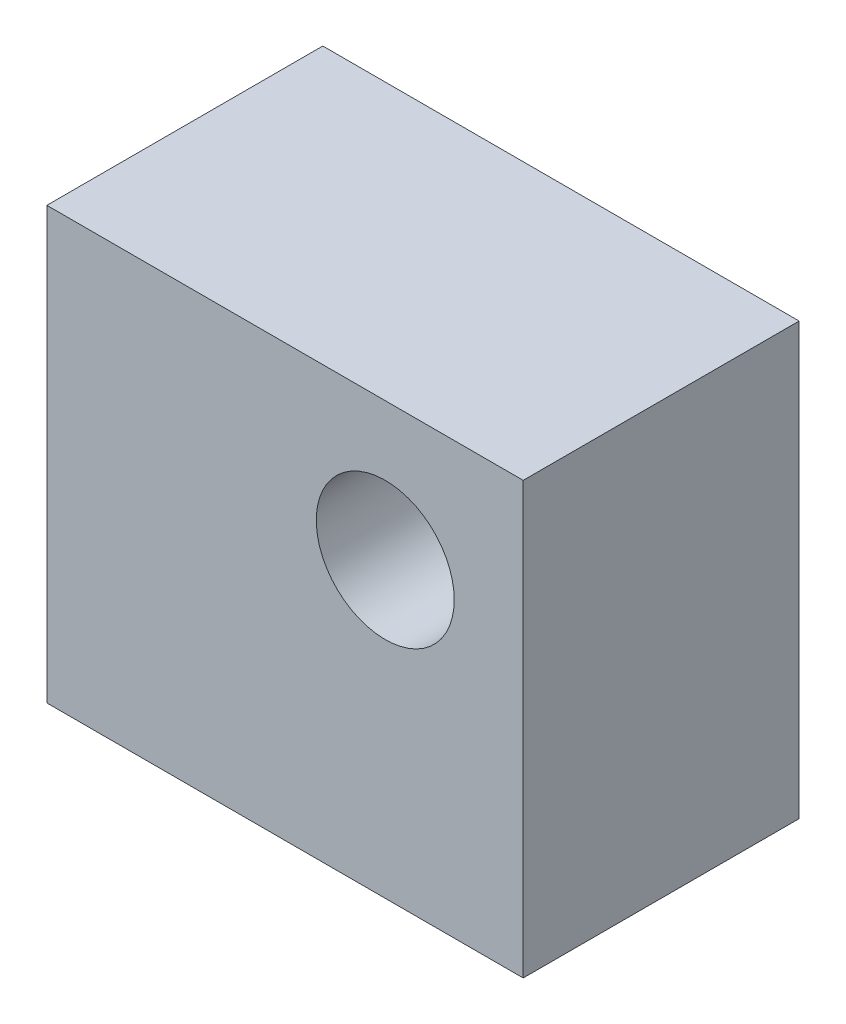
ISO-10303-21;
HEADER;
FILE_DESCRIPTION(('STEP AP214'),'2;1');
FILE_NAME('part.step','',(''),(''),'','','');
FILE_SCHEMA(('AUTOMOTIVE_DESIGN { 1 0 10303 214 1 1 1 1 }'));
ENDSEC;
DATA;
#1=APPLICATION_CONTEXT('core data for automotive mechanical design processes');
#2=APPLICATION_PROTOCOL_DEFINITION('international standard','automotive_design',2000,#1);
#3=PRODUCT_CONTEXT('',#1,'mechanical');
#4=PRODUCT('Part','Part','',(#3));
#5=PRODUCT_RELATED_PRODUCT_CATEGORY('part','',(#4));
#6=PRODUCT_DEFINITION_FORMATION('','',#4);
#7=PRODUCT_DEFINITION_CONTEXT('part definition',#1,'design');
#8=PRODUCT_DEFINITION('design','',#6,#7);
#9=PRODUCT_DEFINITION_SHAPE('','',#8);
#10=(LENGTH_UNIT() NAMED_UNIT(*) SI_UNIT(.MILLI.,.METRE.));
#11=(NAMED_UNIT(*) PLANE_ANGLE_UNIT() SI_UNIT($,.RADIAN.));
#12=(NAMED_UNIT(*) SI_UNIT($,.STERADIAN.) SOLID_ANGLE_UNIT());
#13=UNCERTAINTY_MEASURE_WITH_UNIT(LENGTH_MEASURE(1.E-05),#10,'distance_accuracy_value','');
#14=(GEOMETRIC_REPRESENTATION_CONTEXT(3) GLOBAL_UNCERTAINTY_ASSIGNED_CONTEXT((#13)) GLOBAL_UNIT_ASSIGNED_CONTEXT((#10,
#11,#12)) REPRESENTATION_CONTEXT('',''));
#15=CARTESIAN_POINT('',(0.,0.,0.));
#16=DIRECTION('',(0.,0.,1.));
#17=DIRECTION('',(1.,0.,0.));
#18=AXIS2_PLACEMENT_3D('',#15,#16,#17);
#19=CARTESIAN_POINT('',(0.,-19.8376419710467,6.35));
#20=DIRECTION('',(0.,1.,0.));
#21=DIRECTION('',(-1.,0.,0.));
#22=AXIS2_PLACEMENT_3D('',#19,#20,#21);
#23=PLANE('',#22);
#24=DIRECTION('',(1.,0.,0.));
#25=VECTOR('',#24,1.);
#26=CARTESIAN_POINT('',(0.,-19.8376419710467,-6.35));
#27=LINE('',#26,#25);
#28=CARTESIAN_POINT('',(0.,-19.8376419710467,-6.35));
#29=VERTEX_POINT('',#28);
#30=CARTESIAN_POINT('',(21.9241874454343,-19.8376419710468,-6.35));
#31=VERTEX_POINT('',#30);
#32=EDGE_CURVE('E95',#29,#31,#27,.T.);
#33=ORIENTED_EDGE('',*,*,#32,.T.);
#34=DIRECTION('',(0.,0.,-1.));
#35=VECTOR('',#34,1.);
#36=CARTESIAN_POINT('',(21.9241874454343,-19.8376419710468,6.35));
#37=LINE('',#36,#35);
#38=CARTESIAN_POINT('',(21.9241874454343,-19.8376419710468,6.35));
#39=VERTEX_POINT('',#38);
#40=EDGE_CURVE('E93',#39,#31,#37,.T.);
#41=ORIENTED_EDGE('',*,*,#40,.F.);
#42=DIRECTION('',(1.,0.,0.));
#43=VECTOR('',#42,1.);
#44=CARTESIAN_POINT('',(0.,-19.8376419710467,6.35));
#45=LINE('',#44,#43);
#46=CARTESIAN_POINT('',(0.,-19.8376419710467,6.35));
#47=VERTEX_POINT('',#46);
#48=EDGE_CURVE('E85',#47,#39,#45,.T.);
#49=ORIENTED_EDGE('',*,*,#48,.F.);
#50=DIRECTION('',(0.,0.,-1.));
#51=VECTOR('',#50,1.);
#52=CARTESIAN_POINT('',(0.,-19.8376419710467,6.35));
#53=LINE('',#52,#51);
#54=EDGE_CURVE('E46',#47,#29,#53,.T.);
#55=ORIENTED_EDGE('',*,*,#54,.T.);
#56=EDGE_LOOP('',(#33,#41,#49,#55));
#57=FACE_BOUND('',#56,.T.);
#58=CARTESIAN_POINT('',(7.78709372271712,-19.8376419710468,0.));
#59=DIRECTION('',(0.,1.,0.));
#60=DIRECTION('',(1.,0.,0.));
#61=AXIS2_PLACEMENT_3D('',#58,#59,#60);
#62=ELLIPSE('',#61,3.66617420935412,3.175);
#63=CARTESIAN_POINT('',(11.4532679320712,-19.8376419710468,0.));
#64=VERTEX_POINT('',#63);
#65=EDGE_CURVE('E11',#64,#64,#62,.F.);
#66=ORIENTED_EDGE('',*,*,#65,.F.);
#67=EDGE_LOOP('',(#66));
#68=FACE_BOUND('',#67,.T.);
#69=ADVANCED_FACE('F37',(#57,#68),#23,.F.);
#70=CARTESIAN_POINT('',(0.,0.,6.35));
#71=DIRECTION('',(1.,0.,0.));
#72=DIRECTION('',(0.,1.,0.));
#73=AXIS2_PLACEMENT_3D('',#70,#71,#72);
#74=PLANE('',#73);
#75=CARTESIAN_POINT('',(0.,-6.35,0.));
#76=DIRECTION('',(-1.,0.,0.));
#77=DIRECTION('',(0.,-1.,0.));
#78=AXIS2_PLACEMENT_3D('',#75,#76,#77);
#79=CIRCLE('',#78,3.175);
#80=CARTESIAN_POINT('',(0.,-9.525,0.));
#81=VERTEX_POINT('',#80);
#82=EDGE_CURVE('E192',#81,#81,#79,.T.);
#83=ORIENTED_EDGE('',*,*,#82,.F.);
#84=EDGE_LOOP('',(#83));
#85=FACE_BOUND('',#84,.T.);
#86=DIRECTION('',(0.,-1.,0.));
#87=VECTOR('',#86,1.);
#88=CARTESIAN_POINT('',(0.,0.,-6.35));
#89=LINE('',#88,#87);
#90=CARTESIAN_POINT('',(0.,0.,-6.35));
#91=VERTEX_POINT('',#90);
#92=EDGE_CURVE('E104',#91,#29,#89,.T.);
#93=ORIENTED_EDGE('',*,*,#92,.T.);
#94=ORIENTED_EDGE('',*,*,#54,.F.);
#95=DIRECTION('',(0.,-1.,0.));
#96=VECTOR('',#95,1.);
#97=CARTESIAN_POINT('',(0.,0.,6.35));
#98=LINE('',#97,#96);
#99=CARTESIAN_POINT('',(0.,0.,6.35));
#100=VERTEX_POINT('',#99);
#101=EDGE_CURVE('E90',#100,#47,#98,.T.);
#102=ORIENTED_EDGE('',*,*,#101,.F.);
#103=DIRECTION('',(0.,0.,-1.));
#104=VECTOR('',#103,1.);
#105=CARTESIAN_POINT('',(0.,0.,6.35));
#106=LINE('',#105,#104);
#107=EDGE_CURVE('E100',#100,#91,#106,.T.);
#108=ORIENTED_EDGE('',*,*,#107,.T.);
#109=EDGE_LOOP('',(#93,#94,#102,#108));
#110=FACE_BOUND('',#109,.T.);
#111=ADVANCED_FACE('F39',(#85,#110),#74,.F.);
#112=CARTESIAN_POINT('',(21.9241874454343,0.,6.35));
#113=DIRECTION('',(-1.,0.,0.));
#114=DIRECTION('',(0.,-1.,0.));
#115=AXIS2_PLACEMENT_3D('',#112,#113,#114);
#116=PLANE('',#115);
#117=DIRECTION('',(0.,1.,0.));
#118=VECTOR('',#117,1.);
#119=CARTESIAN_POINT('',(21.9241874454343,0.,-6.35));
#120=LINE('',#119,#118);
#121=CARTESIAN_POINT('',(21.9241874454343,0.,-6.35));
#122=VERTEX_POINT('',#121);
#123=EDGE_CURVE('E71',#31,#122,#120,.T.);
#124=ORIENTED_EDGE('',*,*,#123,.T.);
#125=DIRECTION('',(0.,0.,-1.));
#126=VECTOR('',#125,1.);
#127=CARTESIAN_POINT('',(21.9241874454343,0.,6.35));
#128=LINE('',#127,#126);
#129=CARTESIAN_POINT('',(21.9241874454343,0.,6.35));
#130=VERTEX_POINT('',#129);
#131=EDGE_CURVE('E96',#130,#122,#128,.T.);
#132=ORIENTED_EDGE('',*,*,#131,.F.);
#133=DIRECTION('',(0.,1.,0.));
#134=VECTOR('',#133,1.);
#135=CARTESIAN_POINT('',(21.9241874454343,0.,6.35));
#136=LINE('',#135,#134);
#137=EDGE_CURVE('E88',#39,#130,#136,.T.);
#138=ORIENTED_EDGE('',*,*,#137,.F.);
#139=ORIENTED_EDGE('',*,*,#40,.T.);
#140=EDGE_LOOP('',(#124,#132,#138,#139));
#141=FACE_BOUND('',#140,.T.);
#142=ADVANCED_FACE('F98',(#141),#116,.F.);
#143=CARTESIAN_POINT('',(0.,0.,6.35));
#144=DIRECTION('',(0.,-1.,0.));
#145=DIRECTION('',(0.,0.,-1.));
#146=AXIS2_PLACEMENT_3D('',#143,#144,#145);
#147=PLANE('',#146);
#148=DIRECTION('',(-1.,0.,0.));
#149=VECTOR('',#148,1.);
#150=CARTESIAN_POINT('',(0.,0.,-6.35));
#151=LINE('',#150,#149);
#152=EDGE_CURVE('E77',#122,#91,#151,.T.);
#153=ORIENTED_EDGE('',*,*,#152,.T.);
#154=ORIENTED_EDGE('',*,*,#107,.F.);
#155=DIRECTION('',(-1.,0.,0.));
#156=VECTOR('',#155,1.);
#157=CARTESIAN_POINT('',(0.,0.,6.35));
#158=LINE('',#157,#156);
#159=EDGE_CURVE('E54',#130,#100,#158,.T.);
#160=ORIENTED_EDGE('',*,*,#159,.F.);
#161=ORIENTED_EDGE('',*,*,#131,.T.);
#162=EDGE_LOOP('',(#153,#154,#160,#161));
#163=FACE_BOUND('',#162,.T.);
#164=ADVANCED_FACE('F126',(#163),#147,.F.);
#165=CARTESIAN_POINT('',(0.,0.,6.35));
#166=DIRECTION('',(0.,0.,1.));
#167=DIRECTION('',(1.,0.,0.));
#168=AXIS2_PLACEMENT_3D('',#165,#166,#167);
#169=PLANE('',#168);
#170=CARTESIAN_POINT('',(15.5741874454343,-6.35,6.35));
#171=DIRECTION('',(0.,0.,-1.));
#172=DIRECTION('',(-1.,0.,0.));
#173=AXIS2_PLACEMENT_3D('',#170,#171,#172);
#174=CIRCLE('',#173,3.175);
#175=CARTESIAN_POINT('',(18.7491874454343,-6.35,6.35));
#176=VERTEX_POINT('',#175);
#177=EDGE_CURVE('E201',#176,#176,#174,.T.);
#178=ORIENTED_EDGE('',*,*,#177,.T.);
#179=EDGE_LOOP('',(#178));
#180=FACE_BOUND('',#179,.T.);
#181=ORIENTED_EDGE('',*,*,#101,.T.);
#182=ORIENTED_EDGE('',*,*,#48,.T.);
#183=ORIENTED_EDGE('',*,*,#137,.T.);
#184=ORIENTED_EDGE('',*,*,#159,.T.);
#185=EDGE_LOOP('',(#181,#182,#183,#184));
#186=FACE_BOUND('',#185,.T.);
#187=ADVANCED_FACE('F86',(#180,#186),#169,.T.);
#188=CARTESIAN_POINT('',(0.,0.,-6.35));
#189=DIRECTION('',(0.,0.,1.));
#190=DIRECTION('',(1.,0.,0.));
#191=AXIS2_PLACEMENT_3D('',#188,#189,#190);
#192=PLANE('',#191);
#193=ORIENTED_EDGE('',*,*,#92,.F.);
#194=ORIENTED_EDGE('',*,*,#152,.F.);
#195=ORIENTED_EDGE('',*,*,#123,.F.);
#196=ORIENTED_EDGE('',*,*,#32,.F.);
#197=EDGE_LOOP('',(#193,#194,#195,#196));
#198=FACE_BOUND('',#197,.T.);
#199=ADVANCED_FACE('F115',(#198),#192,.F.);
#200=CARTESIAN_POINT('',(9.525,-6.35,0.));
#201=DIRECTION('',(-1.,0.,0.));
#202=DIRECTION('',(0.,-1.,0.));
#203=AXIS2_PLACEMENT_3D('',#200,#201,#202);
#204=CYLINDRICAL_SURFACE('',#203,3.175);
#205=CARTESIAN_POINT('',(9.525,-6.35,0.));
#206=DIRECTION('',(-1.,0.,0.));
#207=DIRECTION('',(0.,-1.,0.));
#208=AXIS2_PLACEMENT_3D('',#205,#206,#207);
#209=CIRCLE('',#208,3.175);
#210=CARTESIAN_POINT('',(9.525,-9.525,0.));
#211=VERTEX_POINT('',#210);
#212=EDGE_CURVE('E107',#211,#211,#209,.T.);
#213=CARTESIAN_POINT('',(9.525,-9.525,0.));
#214=CARTESIAN_POINT('',(9.42578125,-9.525,0.));
#215=CARTESIAN_POINT('',(9.3265625,-9.525,0.));
#216=CARTESIAN_POINT('',(9.128125,-9.525,0.));
#217=CARTESIAN_POINT('',(9.02890625,-9.525,0.));
#218=CARTESIAN_POINT('',(8.83046875,-9.525,0.));
#219=CARTESIAN_POINT('',(8.73125,-9.525,0.));
#220=CARTESIAN_POINT('',(8.5328125,-9.525,0.));
#221=CARTESIAN_POINT('',(8.43359375,-9.525,0.));
#222=CARTESIAN_POINT('',(8.23515625,-9.525,0.));
#223=CARTESIAN_POINT('',(8.1359375,-9.525,0.));
#224=CARTESIAN_POINT('',(7.9375,-9.525,0.));
#225=CARTESIAN_POINT('',(7.83828125,-9.525,0.));
#226=CARTESIAN_POINT('',(7.63984375,-9.525,0.));
#227=CARTESIAN_POINT('',(7.540625,-9.525,0.));
#228=CARTESIAN_POINT('',(7.3421875,-9.525,0.));
#229=CARTESIAN_POINT('',(7.24296875,-9.525,0.));
#230=CARTESIAN_POINT('',(7.04453125,-9.525,0.));
#231=CARTESIAN_POINT('',(6.9453125,-9.525,0.));
#232=CARTESIAN_POINT('',(6.746875,-9.525,0.));
#233=CARTESIAN_POINT('',(6.64765625,-9.525,0.));
#234=CARTESIAN_POINT('',(6.44921875,-9.525,0.));
#235=CARTESIAN_POINT('',(6.35,-9.525,0.));
#236=CARTESIAN_POINT('',(6.1515625,-9.525,0.));
#237=CARTESIAN_POINT('',(6.05234375,-9.525,0.));
#238=CARTESIAN_POINT('',(5.85390625,-9.525,0.));
#239=CARTESIAN_POINT('',(5.7546875,-9.525,0.));
#240=CARTESIAN_POINT('',(5.55625,-9.525,0.));
#241=CARTESIAN_POINT('',(5.45703125,-9.525,0.));
#242=CARTESIAN_POINT('',(5.25859375,-9.525,0.));
#243=CARTESIAN_POINT('',(5.159375,-9.525,0.));
#244=CARTESIAN_POINT('',(4.9609375,-9.525,0.));
#245=CARTESIAN_POINT('',(4.86171875,-9.525,0.));
#246=CARTESIAN_POINT('',(4.66328125,-9.525,0.));
#247=CARTESIAN_POINT('',(4.5640625,-9.525,0.));
#248=CARTESIAN_POINT('',(4.365625,-9.525,0.));
#249=CARTESIAN_POINT('',(4.26640625,-9.525,0.));
#250=CARTESIAN_POINT('',(4.06796875,-9.525,0.));
#251=CARTESIAN_POINT('',(3.96875,-9.525,0.));
#252=CARTESIAN_POINT('',(3.7703125,-9.525,0.));
#253=CARTESIAN_POINT('',(3.67109375,-9.525,0.));
#254=CARTESIAN_POINT('',(3.47265625,-9.525,0.));
#255=CARTESIAN_POINT('',(3.3734375,-9.525,0.));
#256=CARTESIAN_POINT('',(3.175,-9.525,0.));
#257=CARTESIAN_POINT('',(3.07578125,-9.525,0.));
#258=CARTESIAN_POINT('',(2.87734375,-9.525,0.));
#259=CARTESIAN_POINT('',(2.778125,-9.525,0.));
#260=CARTESIAN_POINT('',(2.5796875,-9.525,0.));
#261=CARTESIAN_POINT('',(2.48046875,-9.525,0.));
#262=CARTESIAN_POINT('',(2.28203125,-9.525,0.));
#263=CARTESIAN_POINT('',(2.1828125,-9.525,0.));
#264=CARTESIAN_POINT('',(1.984375,-9.525,0.));
#265=CARTESIAN_POINT('',(1.88515625,-9.525,0.));
#266=CARTESIAN_POINT('',(1.68671875,-9.525,0.));
#267=CARTESIAN_POINT('',(1.5875,-9.525,0.));
#268=CARTESIAN_POINT('',(1.3890625,-9.525,0.));
#269=CARTESIAN_POINT('',(1.28984375,-9.525,0.));
#270=CARTESIAN_POINT('',(1.09140625,-9.525,0.));
#271=CARTESIAN_POINT('',(0.992187500000001,-9.525,0.));
#272=CARTESIAN_POINT('',(0.793750000000001,-9.525,0.));
#273=CARTESIAN_POINT('',(0.69453125,-9.525,0.));
#274=CARTESIAN_POINT('',(0.49609375,-9.525,0.));
#275=CARTESIAN_POINT('',(0.396875,-9.525,0.));
#276=CARTESIAN_POINT('',(0.1984375,-9.525,0.));
#277=CARTESIAN_POINT('',(0.0992187500000001,-9.525,0.));
#278=CARTESIAN_POINT('',(0.,-9.525,0.));
#279=B_SPLINE_CURVE_WITH_KNOTS('',3,(#213,#214,#215,#216,#217,#218,#219,#220,#221,#222,#223,
#224,#225,#226,#227,#228,#229,#230,#231,#232,#233,#234,#235,#236,#237,#238,#239,#240,#241,#242,
#243,#244,#245,#246,#247,#248,#249,#250,#251,#252,#253,#254,#255,#256,#257,#258,#259,#260,#261,
#262,#263,#264,#265,#266,#267,#268,#269,#270,#271,#272,#273,#274,#275,#276,#277,#278),
.UNSPECIFIED.,.F.,.F.,(4,2,2,2,2,2,2,2,2,2,2,2,2,2,2,2,2,2,2,2,2,2,2,2,2,2,2,2,2,2,2,2,4),(0.,
0.297656249999998,0.595312499999999,0.892968749999999,1.190625,1.48828125,1.7859375,2.08359375,
2.38125,2.67890625,2.9765625,3.27421875,3.571875,3.86953125,4.1671875,4.46484375,4.7625,
5.06015625,5.3578125,5.65546875,5.953125,6.25078125,6.5484375,6.84609375,7.14375,7.44140625,
7.7390625,8.03671875,8.334375,8.63203125,8.9296875,9.22734375,9.525),.UNSPECIFIED.);
#280=EDGE_CURVE('BSEAM117',#211,#81,#279,.T.);
#281=ORIENTED_EDGE('',*,*,#212,.F.);
#282=ORIENTED_EDGE('',*,*,#82,.T.);
#283=ORIENTED_EDGE('',*,*,#280,.T.);
#284=ORIENTED_EDGE('',*,*,#280,.F.);
#285=EDGE_LOOP('',(#281,#283,#282,#284));
#286=FACE_BOUND('',#285,.T.);
#287=ADVANCED_FACE('F117',(#286),#204,.F.);
#288=CARTESIAN_POINT('',(9.525,-6.35,0.));
#289=DIRECTION('',(-1.,0.,0.));
#290=DIRECTION('',(0.,-1.,0.));
#291=AXIS2_PLACEMENT_3D('',#288,#289,#290);
#292=PLANE('',#291);
#293=ORIENTED_EDGE('',*,*,#212,.T.);
#294=EDGE_LOOP('',(#293));
#295=FACE_BOUND('',#294,.T.);
#296=ADVANCED_FACE('F123',(#295),#292,.T.);
#297=CARTESIAN_POINT('',(5.83963727933593,-23.2107354765103,0.));
#298=DIRECTION('',(0.500000000000001,0.866025403784438,0.));
#299=DIRECTION('',(-0.866025403784438,0.500000000000001,0.));
#300=AXIS2_PLACEMENT_3D('',#297,#298,#299);
#301=CYLINDRICAL_SURFACE('',#300,3.175);
#302=CARTESIAN_POINT('',(12.5495937227171,-11.58875,0.));
#303=DIRECTION('',(-0.500000000000001,-0.866025403784438,0.));
#304=DIRECTION('',(0.866025403784438,-0.500000000000001,0.));
#305=AXIS2_PLACEMENT_3D('',#302,#303,#304);
#306=CIRCLE('',#305,3.175);
#307=CARTESIAN_POINT('',(15.2992243797327,-13.17625,0.));
#308=VERTEX_POINT('',#307);
#309=EDGE_CURVE('E195',#308,#308,#306,.T.);
#310=ORIENTED_EDGE('',*,*,#309,.F.);
#311=EDGE_LOOP('',(#310));
#312=FACE_BOUND('',#311,.T.);
#313=ORIENTED_EDGE('',*,*,#65,.T.);
#314=EDGE_LOOP('',(#313));
#315=FACE_BOUND('',#314,.T.);
#316=ADVANCED_FACE('F181',(#312,#315),#301,.F.);
#317=CARTESIAN_POINT('',(12.5495937227171,-11.58875,0.));
#318=DIRECTION('',(-0.500000000000001,-0.866025403784438,0.));
#319=DIRECTION('',(0.866025403784438,-0.500000000000001,0.));
#320=AXIS2_PLACEMENT_3D('',#317,#318,#319);
#321=PLANE('',#320);
#322=ORIENTED_EDGE('',*,*,#309,.T.);
#323=EDGE_LOOP('',(#322));
#324=FACE_BOUND('',#323,.T.);
#325=ADVANCED_FACE('F154',(#324),#321,.T.);
#326=CARTESIAN_POINT('',(15.5741874454343,-6.35,-3.175));
#327=DIRECTION('',(0.,0.,1.));
#328=DIRECTION('',(1.,0.,0.));
#329=AXIS2_PLACEMENT_3D('',#326,#327,#328);
#330=CYLINDRICAL_SURFACE('',#329,3.175);
#331=CARTESIAN_POINT('',(15.5741874454343,-6.35,-3.175));
#332=DIRECTION('',(0.,0.,-1.));
#333=DIRECTION('',(-1.,0.,0.));
#334=AXIS2_PLACEMENT_3D('',#331,#332,#333);
#335=CIRCLE('',#334,3.175);
#336=CARTESIAN_POINT('',(18.7491874454343,-6.35,-3.175));
#337=VERTEX_POINT('',#336);
#338=EDGE_CURVE('E200',#337,#337,#335,.T.);
#339=CARTESIAN_POINT('',(18.7491874454343,-6.35,-3.175));
#340=CARTESIAN_POINT('',(18.7491874454343,-6.35,-3.07578125));
#341=CARTESIAN_POINT('',(18.7491874454343,-6.35,-2.9765625));
#342=CARTESIAN_POINT('',(18.7491874454343,-6.35,-2.778125));
#343=CARTESIAN_POINT('',(18.7491874454343,-6.35,-2.67890625));
#344=CARTESIAN_POINT('',(18.7491874454343,-6.35,-2.48046875));
#345=CARTESIAN_POINT('',(18.7491874454343,-6.35,-2.38125));
#346=CARTESIAN_POINT('',(18.7491874454343,-6.35,-2.1828125));
#347=CARTESIAN_POINT('',(18.7491874454343,-6.35,-2.08359375));
#348=CARTESIAN_POINT('',(18.7491874454343,-6.35,-1.88515625));
#349=CARTESIAN_POINT('',(18.7491874454343,-6.35,-1.7859375));
#350=CARTESIAN_POINT('',(18.7491874454343,-6.35,-1.5875));
#351=CARTESIAN_POINT('',(18.7491874454343,-6.35,-1.48828125));
#352=CARTESIAN_POINT('',(18.7491874454343,-6.35,-1.28984375));
#353=CARTESIAN_POINT('',(18.7491874454343,-6.35,-1.190625));
#354=CARTESIAN_POINT('',(18.7491874454343,-6.35,-0.992187500000001));
#355=CARTESIAN_POINT('',(18.7491874454343,-6.35,-0.892968750000001));
#356=CARTESIAN_POINT('',(18.7491874454343,-6.35,-0.694531250000001));
#357=CARTESIAN_POINT('',(18.7491874454343,-6.35,-0.5953125));
#358=CARTESIAN_POINT('',(18.7491874454343,-6.35,-0.396875));
#359=CARTESIAN_POINT('',(18.7491874454343,-6.35,-0.29765625));
#360=CARTESIAN_POINT('',(18.7491874454343,-6.35,-0.0992187500000004));
#361=CARTESIAN_POINT('',(18.7491874454343,-6.35,0.));
#362=CARTESIAN_POINT('',(18.7491874454343,-6.35,0.1984375));
#363=CARTESIAN_POINT('',(18.7491874454343,-6.35,0.29765625));
#364=CARTESIAN_POINT('',(18.7491874454343,-6.35,0.49609375));
#365=CARTESIAN_POINT('',(18.7491874454343,-6.35,0.5953125));
#366=CARTESIAN_POINT('',(18.7491874454343,-6.35,0.79375));
#367=CARTESIAN_POINT('',(18.7491874454343,-6.35,0.892968749999999));
#368=CARTESIAN_POINT('',(18.7491874454343,-6.35,1.09140625));
#369=CARTESIAN_POINT('',(18.7491874454343,-6.35,1.190625));
#370=CARTESIAN_POINT('',(18.7491874454343,-6.35,1.3890625));
#371=CARTESIAN_POINT('',(18.7491874454343,-6.35,1.48828125));
#372=CARTESIAN_POINT('',(18.7491874454343,-6.35,1.68671875));
#373=CARTESIAN_POINT('',(18.7491874454343,-6.35,1.7859375));
#374=CARTESIAN_POINT('',(18.7491874454343,-6.35,1.984375));
#375=CARTESIAN_POINT('',(18.7491874454343,-6.35,2.08359375));
#376=CARTESIAN_POINT('',(18.7491874454343,-6.35,2.28203125));
#377=CARTESIAN_POINT('',(18.7491874454343,-6.35,2.38125));
#378=CARTESIAN_POINT('',(18.7491874454343,-6.35,2.5796875));
#379=CARTESIAN_POINT('',(18.7491874454343,-6.35,2.67890625));
#380=CARTESIAN_POINT('',(18.7491874454343,-6.35,2.87734375));
#381=CARTESIAN_POINT('',(18.7491874454343,-6.35,2.9765625));
#382=CARTESIAN_POINT('',(18.7491874454343,-6.35,3.175));
#383=CARTESIAN_POINT('',(18.7491874454343,-6.35,3.27421875));
#384=CARTESIAN_POINT('',(18.7491874454343,-6.35,3.47265625));
#385=CARTESIAN_POINT('',(18.7491874454343,-6.35,3.571875));
#386=CARTESIAN_POINT('',(18.7491874454343,-6.35,3.7703125));
#387=CARTESIAN_POINT('',(18.7491874454343,-6.35,3.86953125));
#388=CARTESIAN_POINT('',(18.7491874454343,-6.35,4.06796875));
#389=CARTESIAN_POINT('',(18.7491874454343,-6.35,4.1671875));
#390=CARTESIAN_POINT('',(18.7491874454343,-6.35,4.365625));
#391=CARTESIAN_POINT('',(18.7491874454343,-6.35,4.46484375));
#392=CARTESIAN_POINT('',(18.7491874454343,-6.35,4.66328125));
#393=CARTESIAN_POINT('',(18.7491874454343,-6.35,4.7625));
#394=CARTESIAN_POINT('',(18.7491874454343,-6.35,4.9609375));
#395=CARTESIAN_POINT('',(18.7491874454343,-6.35,5.06015625));
#396=CARTESIAN_POINT('',(18.7491874454343,-6.35,5.25859375));
#397=CARTESIAN_POINT('',(18.7491874454343,-6.35,5.3578125));
#398=CARTESIAN_POINT('',(18.7491874454343,-6.35,5.55625));
#399=CARTESIAN_POINT('',(18.7491874454343,-6.35,5.65546875));
#400=CARTESIAN_POINT('',(18.7491874454343,-6.35,5.85390625));
#401=CARTESIAN_POINT('',(18.7491874454343,-6.35,5.953125));
#402=CARTESIAN_POINT('',(18.7491874454343,-6.35,6.1515625));
#403=CARTESIAN_POINT('',(18.7491874454343,-6.35,6.25078125));
#404=CARTESIAN_POINT('',(18.7491874454343,-6.35,6.35));
#405=B_SPLINE_CURVE_WITH_KNOTS('',3,(#339,#340,#341,#342,#343,#344,#345,#346,#347,#348,#349,
#350,#351,#352,#353,#354,#355,#356,#357,#358,#359,#360,#361,#362,#363,#364,#365,#366,#367,#368,
#369,#370,#371,#372,#373,#374,#375,#376,#377,#378,#379,#380,#381,#382,#383,#384,#385,#386,#387,
#388,#389,#390,#391,#392,#393,#394,#395,#396,#397,#398,#399,#400,#401,#402,#403,#404),
.UNSPECIFIED.,.F.,.F.,(4,2,2,2,2,2,2,2,2,2,2,2,2,2,2,2,2,2,2,2,2,2,2,2,2,2,2,2,2,2,2,2,4),(0.,
0.29765625,0.5953125,0.892968750000001,1.190625,1.48828125,1.7859375,2.08359375,2.38125,
2.67890625,2.9765625,3.27421875,3.571875,3.86953125,4.1671875,4.46484375,4.7625,5.06015625,
5.3578125,5.65546875,5.953125,6.25078125,6.5484375,6.84609375,7.14375,7.44140625,7.7390625,
8.03671875,8.334375,8.63203125,8.9296875,9.22734375,9.525),.UNSPECIFIED.);
#406=EDGE_CURVE('BSEAM159',#337,#176,#405,.T.);
#407=ORIENTED_EDGE('',*,*,#338,.T.);
#408=ORIENTED_EDGE('',*,*,#177,.F.);
#409=ORIENTED_EDGE('',*,*,#406,.T.);
#410=ORIENTED_EDGE('',*,*,#406,.F.);
#411=EDGE_LOOP('',(#407,#409,#408,#410));
#412=FACE_BOUND('',#411,.T.);
#413=ADVANCED_FACE('F159',(#412),#330,.F.);
#414=CARTESIAN_POINT('',(15.5741874454343,-6.35,-3.175));
#415=DIRECTION('',(0.,0.,-1.));
#416=DIRECTION('',(-1.,0.,0.));
#417=AXIS2_PLACEMENT_3D('',#414,#415,#416);
#418=PLANE('',#417);
#419=ORIENTED_EDGE('',*,*,#338,.F.);
#420=EDGE_LOOP('',(#419));
#421=FACE_BOUND('',#420,.T.);
#422=ADVANCED_FACE('F164',(#421),#418,.F.);
#423=CLOSED_SHELL('',(#69,#111,#142,#164,#187,#199,#287,#296,#316,#325,#413,#422));
#424=MANIFOLD_SOLID_BREP('B2',#423);
#425=ADVANCED_BREP_SHAPE_REPRESENTATION('',(#18,#424),#14);
#426=SHAPE_DEFINITION_REPRESENTATION(#9,#425);
ENDSEC;
END-ISO-10303-21;
